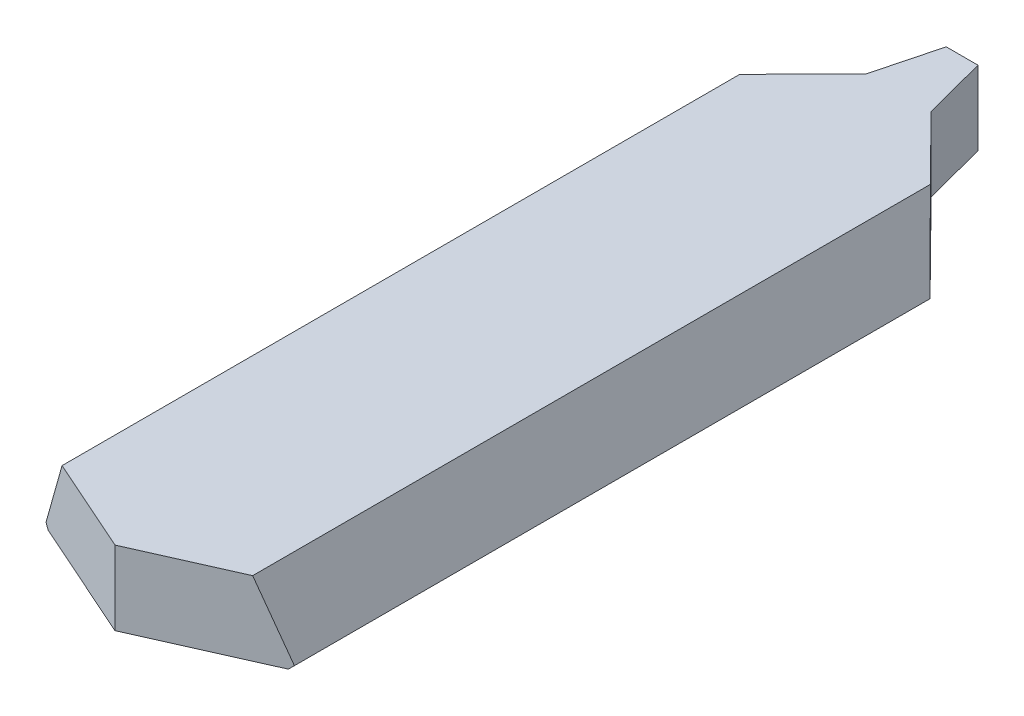
ISO-10303-21;
HEADER;
FILE_DESCRIPTION(('STEP AP214'),'2;1');
FILE_NAME('part.step','',(''),(''),'','','');
FILE_SCHEMA(('AUTOMOTIVE_DESIGN { 1 0 10303 214 1 1 1 1 }'));
ENDSEC;
DATA;
#1=APPLICATION_CONTEXT('core data for automotive mechanical design processes');
#2=APPLICATION_PROTOCOL_DEFINITION('international standard','automotive_design',2000,#1);
#3=PRODUCT_CONTEXT('',#1,'mechanical');
#4=PRODUCT('Part','Part','',(#3));
#5=PRODUCT_RELATED_PRODUCT_CATEGORY('part','',(#4));
#6=PRODUCT_DEFINITION_FORMATION('','',#4);
#7=PRODUCT_DEFINITION_CONTEXT('part definition',#1,'design');
#8=PRODUCT_DEFINITION('design','',#6,#7);
#9=PRODUCT_DEFINITION_SHAPE('','',#8);
#10=(LENGTH_UNIT() NAMED_UNIT(*) SI_UNIT(.MILLI.,.METRE.));
#11=(NAMED_UNIT(*) PLANE_ANGLE_UNIT() SI_UNIT($,.RADIAN.));
#12=(NAMED_UNIT(*) SI_UNIT($,.STERADIAN.) SOLID_ANGLE_UNIT());
#13=UNCERTAINTY_MEASURE_WITH_UNIT(LENGTH_MEASURE(1.E-05),#10,'distance_accuracy_value','');
#14=(GEOMETRIC_REPRESENTATION_CONTEXT(3) GLOBAL_UNCERTAINTY_ASSIGNED_CONTEXT((#13)) GLOBAL_UNIT_ASSIGNED_CONTEXT((#10,
#11,#12)) REPRESENTATION_CONTEXT('',''));
#15=CARTESIAN_POINT('',(0.,0.,0.));
#16=DIRECTION('',(0.,0.,1.));
#17=DIRECTION('',(1.,0.,0.));
#18=AXIS2_PLACEMENT_3D('',#15,#16,#17);
#19=CARTESIAN_POINT('',(-9.,0.,58.));
#20=DIRECTION('',(0.,-1.,0.));
#21=DIRECTION('',(1.,0.,0.));
#22=AXIS2_PLACEMENT_3D('',#19,#20,#21);
#23=PLANE('',#22);
#24=DIRECTION('',(-0.702944856067836,0.,0.711244352756328));
#25=VECTOR('',#24,1.);
#26=CARTESIAN_POINT('',(-11.7303877640284,0.,-7.23737522049271));
#27=LINE('',#26,#25);
#28=CARTESIAN_POINT('',(-3.0700138847331,0.,-16.));
#29=VERTEX_POINT('',#28);
#30=CARTESIAN_POINT('',(-9.,0.,-10.));
#31=VERTEX_POINT('',#30);
#32=EDGE_CURVE('E159',#29,#31,#27,.T.);
#33=ORIENTED_EDGE('',*,*,#32,.T.);
#34=DIRECTION('',(0.,0.,-1.));
#35=VECTOR('',#34,1.);
#36=CARTESIAN_POINT('',(-9.,0.,58.));
#37=LINE('',#36,#35);
#38=CARTESIAN_POINT('',(-9.,0.,54.));
#39=VERTEX_POINT('',#38);
#40=EDGE_CURVE('E41',#39,#31,#37,.T.);
#41=ORIENTED_EDGE('',*,*,#40,.F.);
#42=DIRECTION('',(0.913811548620257,0.,0.406138466053447));
#43=VECTOR('',#42,1.);
#44=CARTESIAN_POINT('',(0.,0.,58.));
#45=LINE('',#44,#43);
#46=CARTESIAN_POINT('',(0.,0.,58.));
#47=VERTEX_POINT('',#46);
#48=EDGE_CURVE('E147',#39,#47,#45,.T.);
#49=ORIENTED_EDGE('',*,*,#48,.T.);
#50=DIRECTION('',(0.913811548620257,0.,-0.406138466053447));
#51=VECTOR('',#50,1.);
#52=CARTESIAN_POINT('',(11.7303877640284,0.,52.7864943270985));
#53=LINE('',#52,#51);
#54=CARTESIAN_POINT('',(9.,0.,54.));
#55=VERTEX_POINT('',#54);
#56=EDGE_CURVE('E150',#47,#55,#53,.T.);
#57=ORIENTED_EDGE('',*,*,#56,.T.);
#58=DIRECTION('',(0.,0.,-1.));
#59=VECTOR('',#58,1.);
#60=CARTESIAN_POINT('',(9.,0.,58.));
#61=LINE('',#60,#59);
#62=CARTESIAN_POINT('',(8.99999999999999,0.,-10.));
#63=VERTEX_POINT('',#62);
#64=EDGE_CURVE('E186',#55,#63,#61,.T.);
#65=ORIENTED_EDGE('',*,*,#64,.T.);
#66=DIRECTION('',(-0.702944856067837,0.,-0.711244352756328));
#67=VECTOR('',#66,1.);
#68=CARTESIAN_POINT('',(3.0700138847331,0.,-16.));
#69=LINE('',#68,#67);
#70=CARTESIAN_POINT('',(3.0700138847331,0.,-16.));
#71=VERTEX_POINT('',#70);
#72=EDGE_CURVE('E153',#63,#71,#69,.T.);
#73=ORIENTED_EDGE('',*,*,#72,.T.);
#74=DIRECTION('',(-0.253145926436177,0.,-0.96742810581912));
#75=VECTOR('',#74,1.);
#76=CARTESIAN_POINT('',(1.5,0.,-22.));
#77=LINE('',#76,#75);
#78=CARTESIAN_POINT('',(1.5,0.,-22.));
#79=VERTEX_POINT('',#78);
#80=EDGE_CURVE('E128',#71,#79,#77,.T.);
#81=ORIENTED_EDGE('',*,*,#80,.T.);
#82=DIRECTION('',(-1.,0.,0.));
#83=VECTOR('',#82,1.);
#84=CARTESIAN_POINT('',(-9.,0.,-22.));
#85=LINE('',#84,#83);
#86=CARTESIAN_POINT('',(-1.5,0.,-22.));
#87=VERTEX_POINT('',#86);
#88=EDGE_CURVE('E182',#79,#87,#85,.T.);
#89=ORIENTED_EDGE('',*,*,#88,.T.);
#90=DIRECTION('',(-0.253145926436177,0.,0.96742810581912));
#91=VECTOR('',#90,1.);
#92=CARTESIAN_POINT('',(-3.0700138847331,0.,-16.));
#93=LINE('',#92,#91);
#94=EDGE_CURVE('E156',#87,#29,#93,.T.);
#95=ORIENTED_EDGE('',*,*,#94,.T.);
#96=EDGE_LOOP('',(#33,#41,#49,#57,#65,#73,#81,#89,#95));
#97=FACE_BOUND('',#96,.T.);
#98=ADVANCED_FACE('F34',(#97),#23,.F.);
#99=CARTESIAN_POINT('',(-11.7303877640284,-6.60789100354839,58.));
#100=DIRECTION('',(0.924210020359106,-0.381884587628017,0.));
#101=DIRECTION('',(0.381884587628017,0.924210020359106,0.));
#102=AXIS2_PLACEMENT_3D('',#99,#100,#101);
#103=PLANE('',#102);
#104=DIRECTION('',(0.356217665907885,0.862092755054265,-0.360423440106337));
#105=VECTOR('',#104,1.);
#106=CARTESIAN_POINT('',(-20.1061619551299,-26.8783462312975,1.23728967243628));
#107=LINE('',#106,#105);
#108=CARTESIAN_POINT('',(-11.7303877640284,-6.6078910035484,-7.23737522049271));
#109=VERTEX_POINT('',#108);
#110=EDGE_CURVE('E180',#109,#31,#107,.T.);
#111=ORIENTED_EDGE('',*,*,#110,.F.);
#112=DIRECTION('',(0.,0.,-1.));
#113=VECTOR('',#112,1.);
#114=CARTESIAN_POINT('',(-11.7303877640284,-6.60789100354839,58.));
#115=LINE('',#114,#113);
#116=CARTESIAN_POINT('',(-11.7303877640284,-6.60789100354839,52.7864943270985));
#117=VERTEX_POINT('',#116);
#118=EDGE_CURVE('E197',#117,#109,#115,.T.);
#119=ORIENTED_EDGE('',*,*,#118,.F.);
#120=DIRECTION('',(-0.376500154874984,-0.911178997726816,-0.167333402166659));
#121=VECTOR('',#120,1.);
#122=CARTESIAN_POINT('',(-11.4019314229061,-5.81298423969799,52.9324749231528));
#123=LINE('',#122,#121);
#124=EDGE_CURVE('E172',#39,#117,#123,.T.);
#125=ORIENTED_EDGE('',*,*,#124,.F.);
#126=ORIENTED_EDGE('',*,*,#40,.T.);
#127=EDGE_LOOP('',(#111,#119,#125,#126));
#128=FACE_BOUND('',#127,.T.);
#129=ADVANCED_FACE('F204',(#128),#103,.F.);
#130=CARTESIAN_POINT('',(-11.3369204912887,-7.,58.));
#131=DIRECTION('',(0.705883125013036,0.70832832346436,0.));
#132=DIRECTION('',(-0.70832832346436,0.705883125013036,0.));
#133=AXIS2_PLACEMENT_3D('',#130,#131,#132);
#134=PLANE('',#133);
#135=DIRECTION('',(-0.575734655946524,0.573747180022635,0.582532213150666));
#136=VECTOR('',#135,1.);
#137=CARTESIAN_POINT('',(-33.3500119252076,14.9371007170437,14.6375065154212));
#138=LINE('',#137,#136);
#139=CARTESIAN_POINT('',(-11.3369204912887,-7.,-7.63548806435928));
#140=VERTEX_POINT('',#139);
#141=EDGE_CURVE('E178',#140,#109,#138,.T.);
#142=ORIENTED_EDGE('',*,*,#141,.F.);
#143=DIRECTION('',(0.,0.,-1.));
#144=VECTOR('',#143,1.);
#145=CARTESIAN_POINT('',(-11.3369204912887,-7.,58.));
#146=LINE('',#145,#144);
#147=CARTESIAN_POINT('',(-11.3369204912887,-7.,52.9613686705383));
#148=VERTEX_POINT('',#147);
#149=EDGE_CURVE('E194',#148,#140,#146,.T.);
#150=ORIENTED_EDGE('',*,*,#149,.F.);
#151=DIRECTION('',(0.675638871509101,-0.673306519310916,0.300283942892933));
#152=VECTOR('',#151,1.);
#153=CARTESIAN_POINT('',(-10.314665310249,-8.01872628532463,53.415704306556));
#154=LINE('',#153,#152);
#155=EDGE_CURVE('E165',#117,#148,#154,.T.);
#156=ORIENTED_EDGE('',*,*,#155,.F.);
#157=ORIENTED_EDGE('',*,*,#118,.T.);
#158=EDGE_LOOP('',(#142,#150,#156,#157));
#159=FACE_BOUND('',#158,.T.);
#160=ADVANCED_FACE('F213',(#159),#134,.F.);
#161=CARTESIAN_POINT('',(11.3369204912887,-7.,58.));
#162=DIRECTION('',(0.,1.,0.));
#163=DIRECTION('',(-1.,0.,0.));
#164=AXIS2_PLACEMENT_3D('',#161,#162,#163);
#165=PLANE('',#164);
#166=DIRECTION('',(-0.702944856067836,0.,0.711244352756328));
#167=VECTOR('',#166,1.);
#168=CARTESIAN_POINT('',(-11.7303877640284,-7.,-7.23737522049271));
#169=LINE('',#168,#167);
#170=CARTESIAN_POINT('',(-3.0700138847331,-7.,-16.));
#171=VERTEX_POINT('',#170);
#172=EDGE_CURVE('E142',#171,#140,#169,.T.);
#173=ORIENTED_EDGE('',*,*,#172,.F.);
#174=DIRECTION('',(-0.253145926436177,0.,0.96742810581912));
#175=VECTOR('',#174,1.);
#176=CARTESIAN_POINT('',(-3.0700138847331,-7.,-16.));
#177=LINE('',#176,#175);
#178=CARTESIAN_POINT('',(-1.5,-7.,-22.));
#179=VERTEX_POINT('',#178);
#180=EDGE_CURVE('E139',#179,#171,#177,.T.);
#181=ORIENTED_EDGE('',*,*,#180,.F.);
#182=DIRECTION('',(1.,0.,0.));
#183=VECTOR('',#182,1.);
#184=CARTESIAN_POINT('',(11.3369204912887,-7.,-22.));
#185=LINE('',#184,#183);
#186=CARTESIAN_POINT('',(1.5,-7.,-22.));
#187=VERTEX_POINT('',#186);
#188=EDGE_CURVE('E138',#179,#187,#185,.T.);
#189=ORIENTED_EDGE('',*,*,#188,.T.);
#190=DIRECTION('',(-0.253145926436177,0.,-0.96742810581912));
#191=VECTOR('',#190,1.);
#192=CARTESIAN_POINT('',(1.5,-7.,-22.));
#193=LINE('',#192,#191);
#194=CARTESIAN_POINT('',(3.0700138847331,-7.,-16.));
#195=VERTEX_POINT('',#194);
#196=EDGE_CURVE('E56',#195,#187,#193,.T.);
#197=ORIENTED_EDGE('',*,*,#196,.F.);
#198=DIRECTION('',(-0.702944856067837,0.,-0.711244352756328));
#199=VECTOR('',#198,1.);
#200=CARTESIAN_POINT('',(3.0700138847331,-7.,-16.));
#201=LINE('',#200,#199);
#202=CARTESIAN_POINT('',(11.3369204912887,-6.99999999999999,-7.63548806435926));
#203=VERTEX_POINT('',#202);
#204=EDGE_CURVE('E115',#203,#195,#201,.T.);
#205=ORIENTED_EDGE('',*,*,#204,.F.);
#206=DIRECTION('',(0.,0.,-1.));
#207=VECTOR('',#206,1.);
#208=CARTESIAN_POINT('',(11.3369204912887,-7.,58.));
#209=LINE('',#208,#207);
#210=CARTESIAN_POINT('',(11.3369204912887,-7.,52.9613686705384));
#211=VERTEX_POINT('',#210);
#212=EDGE_CURVE('E192',#211,#203,#209,.T.);
#213=ORIENTED_EDGE('',*,*,#212,.F.);
#214=DIRECTION('',(0.913811548620257,0.,-0.406138466053447));
#215=VECTOR('',#214,1.);
#216=CARTESIAN_POINT('',(11.7303877640284,-7.,52.7864943270985));
#217=LINE('',#216,#215);
#218=CARTESIAN_POINT('',(0.,-7.,58.));
#219=VERTEX_POINT('',#218);
#220=EDGE_CURVE('E124',#219,#211,#217,.T.);
#221=ORIENTED_EDGE('',*,*,#220,.F.);
#222=DIRECTION('',(0.913811548620257,0.,0.406138466053447));
#223=VECTOR('',#222,1.);
#224=CARTESIAN_POINT('',(0.,-7.,58.));
#225=LINE('',#224,#223);
#226=EDGE_CURVE('E162',#148,#219,#225,.T.);
#227=ORIENTED_EDGE('',*,*,#226,.F.);
#228=ORIENTED_EDGE('',*,*,#149,.T.);
#229=EDGE_LOOP('',(#173,#181,#189,#197,#205,#213,#221,#227,#228));
#230=FACE_BOUND('',#229,.T.);
#231=ADVANCED_FACE('F135',(#230),#165,.F.);
#232=CARTESIAN_POINT('',(11.7303877640284,-6.60789100354839,58.));
#233=DIRECTION('',(-0.705883125013039,0.708328323464356,0.));
#234=DIRECTION('',(-0.708328323464356,-0.70588312501304,0.));
#235=AXIS2_PLACEMENT_3D('',#232,#233,#234);
#236=PLANE('',#235);
#237=DIRECTION('',(-0.575734655946522,-0.573747180022639,-0.582532213150663));
#238=VECTOR('',#237,1.);
#239=CARTESIAN_POINT('',(33.6099585265619,15.1961499647191,14.9005222422389));
#240=LINE('',#239,#238);
#241=CARTESIAN_POINT('',(11.7303877640284,-6.6078910035484,-7.23737522049271));
#242=VERTEX_POINT('',#241);
#243=EDGE_CURVE('E120',#242,#203,#240,.T.);
#244=ORIENTED_EDGE('',*,*,#243,.F.);
#245=DIRECTION('',(0.,0.,-1.));
#246=VECTOR('',#245,1.);
#247=CARTESIAN_POINT('',(11.7303877640284,-6.60789100354839,58.));
#248=LINE('',#247,#246);
#249=CARTESIAN_POINT('',(11.7303877640284,-6.60789100354839,52.7864943270985));
#250=VERTEX_POINT('',#249);
#251=EDGE_CURVE('E189',#250,#242,#248,.T.);
#252=ORIENTED_EDGE('',*,*,#251,.F.);
#253=DIRECTION('',(0.675638871509098,0.67330651931092,-0.300283942892932));
#254=VECTOR('',#253,1.);
#255=CARTESIAN_POINT('',(10.672653463378,-7.66197393210457,53.2565984607209));
#256=LINE('',#255,#254);
#257=EDGE_CURVE('E48',#211,#250,#256,.T.);
#258=ORIENTED_EDGE('',*,*,#257,.F.);
#259=ORIENTED_EDGE('',*,*,#212,.T.);
#260=EDGE_LOOP('',(#244,#252,#258,#259));
#261=FACE_BOUND('',#260,.T.);
#262=ADVANCED_FACE('F224',(#261),#236,.F.);
#263=CARTESIAN_POINT('',(9.,0.,58.));
#264=DIRECTION('',(-0.924210020359106,-0.381884587628016,0.));
#265=DIRECTION('',(0.381884587628016,-0.924210020359107,0.));
#266=AXIS2_PLACEMENT_3D('',#263,#264,#265);
#267=PLANE('',#266);
#268=DIRECTION('',(0.356217665907884,-0.862092755054266,0.360423440106336));
#269=VECTOR('',#268,1.);
#270=CARTESIAN_POINT('',(17.7304653669755,-21.1288536797837,-1.16645617989019));
#271=LINE('',#270,#269);
#272=EDGE_CURVE('E12',#63,#242,#271,.T.);
#273=ORIENTED_EDGE('',*,*,#272,.F.);
#274=ORIENTED_EDGE('',*,*,#64,.F.);
#275=DIRECTION('',(-0.376500154874983,0.911178997726816,0.167333402166659));
#276=VECTOR('',#275,1.);
#277=CARTESIAN_POINT('',(8.74799579267398,0.609882726689735,54.1120018699227));
#278=LINE('',#277,#276);
#279=EDGE_CURVE('E174',#250,#55,#278,.T.);
#280=ORIENTED_EDGE('',*,*,#279,.F.);
#281=ORIENTED_EDGE('',*,*,#251,.T.);
#282=EDGE_LOOP('',(#273,#274,#280,#281));
#283=FACE_BOUND('',#282,.T.);
#284=ADVANCED_FACE('F227',(#283),#267,.F.);
#285=CARTESIAN_POINT('',(0.,0.,-22.));
#286=DIRECTION('',(0.,0.,-1.));
#287=DIRECTION('',(-1.,0.,0.));
#288=AXIS2_PLACEMENT_3D('',#285,#286,#287);
#289=PLANE('',#288);
#290=ORIENTED_EDGE('',*,*,#188,.F.);
#291=DIRECTION('',(0.,1.,0.));
#292=VECTOR('',#291,1.);
#293=CARTESIAN_POINT('',(-1.5,-7.,-22.));
#294=LINE('',#293,#292);
#295=EDGE_CURVE('E166',#179,#87,#294,.T.);
#296=ORIENTED_EDGE('',*,*,#295,.T.);
#297=ORIENTED_EDGE('',*,*,#88,.F.);
#298=DIRECTION('',(0.,1.,0.));
#299=VECTOR('',#298,1.);
#300=CARTESIAN_POINT('',(1.5,-7.,-22.));
#301=LINE('',#300,#299);
#302=EDGE_CURVE('E130',#187,#79,#301,.T.);
#303=ORIENTED_EDGE('',*,*,#302,.F.);
#304=EDGE_LOOP('',(#290,#296,#297,#303));
#305=FACE_BOUND('',#304,.T.);
#306=ADVANCED_FACE('F231',(#305),#289,.T.);
#307=CARTESIAN_POINT('',(1.5,-7.,-22.));
#308=DIRECTION('',(0.96742810581912,0.,-0.253145926436177));
#309=DIRECTION('',(-0.253145926436177,0.,-0.96742810581912));
#310=AXIS2_PLACEMENT_3D('',#307,#308,#309);
#311=PLANE('',#310);
#312=ORIENTED_EDGE('',*,*,#80,.F.);
#313=DIRECTION('',(0.,1.,0.));
#314=VECTOR('',#313,1.);
#315=CARTESIAN_POINT('',(3.0700138847331,-7.,-16.));
#316=LINE('',#315,#314);
#317=EDGE_CURVE('E117',#195,#71,#316,.T.);
#318=ORIENTED_EDGE('',*,*,#317,.F.);
#319=ORIENTED_EDGE('',*,*,#196,.T.);
#320=ORIENTED_EDGE('',*,*,#302,.T.);
#321=EDGE_LOOP('',(#312,#318,#319,#320));
#322=FACE_BOUND('',#321,.T.);
#323=ADVANCED_FACE('F126',(#322),#311,.T.);
#324=CARTESIAN_POINT('',(3.0700138847331,-7.,-16.));
#325=DIRECTION('',(0.711244352756328,0.,-0.702944856067837));
#326=DIRECTION('',(-0.702944856067837,0.,-0.711244352756328));
#327=AXIS2_PLACEMENT_3D('',#324,#325,#326);
#328=PLANE('',#327);
#329=ORIENTED_EDGE('',*,*,#243,.T.);
#330=ORIENTED_EDGE('',*,*,#204,.T.);
#331=ORIENTED_EDGE('',*,*,#317,.T.);
#332=ORIENTED_EDGE('',*,*,#72,.F.);
#333=ORIENTED_EDGE('',*,*,#272,.T.);
#334=EDGE_LOOP('',(#329,#330,#331,#332,#333));
#335=FACE_BOUND('',#334,.T.);
#336=ADVANCED_FACE('F116',(#335),#328,.T.);
#337=CARTESIAN_POINT('',(-3.0700138847331,-7.,-16.));
#338=DIRECTION('',(-0.96742810581912,0.,-0.253145926436177));
#339=DIRECTION('',(-0.253145926436177,0.,0.96742810581912));
#340=AXIS2_PLACEMENT_3D('',#337,#338,#339);
#341=PLANE('',#340);
#342=ORIENTED_EDGE('',*,*,#94,.F.);
#343=ORIENTED_EDGE('',*,*,#295,.F.);
#344=ORIENTED_EDGE('',*,*,#180,.T.);
#345=DIRECTION('',(0.,1.,0.));
#346=VECTOR('',#345,1.);
#347=CARTESIAN_POINT('',(-3.0700138847331,-7.,-16.));
#348=LINE('',#347,#346);
#349=EDGE_CURVE('E163',#171,#29,#348,.T.);
#350=ORIENTED_EDGE('',*,*,#349,.T.);
#351=EDGE_LOOP('',(#342,#343,#344,#350));
#352=FACE_BOUND('',#351,.T.);
#353=ADVANCED_FACE('F233',(#352),#341,.T.);
#354=CARTESIAN_POINT('',(-11.7303877640284,-7.,-7.23737522049271));
#355=DIRECTION('',(-0.711244352756328,0.,-0.702944856067836));
#356=DIRECTION('',(-0.702944856067837,0.,0.711244352756329));
#357=AXIS2_PLACEMENT_3D('',#354,#355,#356);
#358=PLANE('',#357);
#359=ORIENTED_EDGE('',*,*,#110,.T.);
#360=ORIENTED_EDGE('',*,*,#32,.F.);
#361=ORIENTED_EDGE('',*,*,#349,.F.);
#362=ORIENTED_EDGE('',*,*,#172,.T.);
#363=ORIENTED_EDGE('',*,*,#141,.T.);
#364=EDGE_LOOP('',(#359,#360,#361,#362,#363));
#365=FACE_BOUND('',#364,.T.);
#366=ADVANCED_FACE('F209',(#365),#358,.T.);
#367=CARTESIAN_POINT('',(11.7303877640284,-7.,52.7864943270985));
#368=DIRECTION('',(0.406138466053447,0.,0.913811548620257));
#369=DIRECTION('',(0.913811548620257,0.,-0.406138466053447));
#370=AXIS2_PLACEMENT_3D('',#367,#368,#369);
#371=PLANE('',#370);
#372=ORIENTED_EDGE('',*,*,#257,.T.);
#373=ORIENTED_EDGE('',*,*,#279,.T.);
#374=ORIENTED_EDGE('',*,*,#56,.F.);
#375=DIRECTION('',(0.,1.,0.));
#376=VECTOR('',#375,1.);
#377=CARTESIAN_POINT('',(0.,-7.,58.));
#378=LINE('',#377,#376);
#379=EDGE_CURVE('E131',#219,#47,#378,.T.);
#380=ORIENTED_EDGE('',*,*,#379,.F.);
#381=ORIENTED_EDGE('',*,*,#220,.T.);
#382=EDGE_LOOP('',(#372,#373,#374,#380,#381));
#383=FACE_BOUND('',#382,.T.);
#384=ADVANCED_FACE('F220',(#383),#371,.T.);
#385=CARTESIAN_POINT('',(0.,-7.,58.));
#386=DIRECTION('',(-0.406138466053447,0.,0.913811548620257));
#387=DIRECTION('',(0.913811548620257,0.,0.406138466053447));
#388=AXIS2_PLACEMENT_3D('',#385,#386,#387);
#389=PLANE('',#388);
#390=ORIENTED_EDGE('',*,*,#124,.T.);
#391=ORIENTED_EDGE('',*,*,#155,.T.);
#392=ORIENTED_EDGE('',*,*,#226,.T.);
#393=ORIENTED_EDGE('',*,*,#379,.T.);
#394=ORIENTED_EDGE('',*,*,#48,.F.);
#395=EDGE_LOOP('',(#390,#391,#392,#393,#394));
#396=FACE_BOUND('',#395,.T.);
#397=ADVANCED_FACE('F260',(#396),#389,.T.);
#398=CLOSED_SHELL('',(#98,#129,#160,#231,#262,#284,#306,#323,#336,#353,#366,#384,#397));
#399=MANIFOLD_SOLID_BREP('B2',#398);
#400=ADVANCED_BREP_SHAPE_REPRESENTATION('',(#18,#399),#14);
#401=SHAPE_DEFINITION_REPRESENTATION(#9,#400);
ENDSEC;
END-ISO-10303-21;
